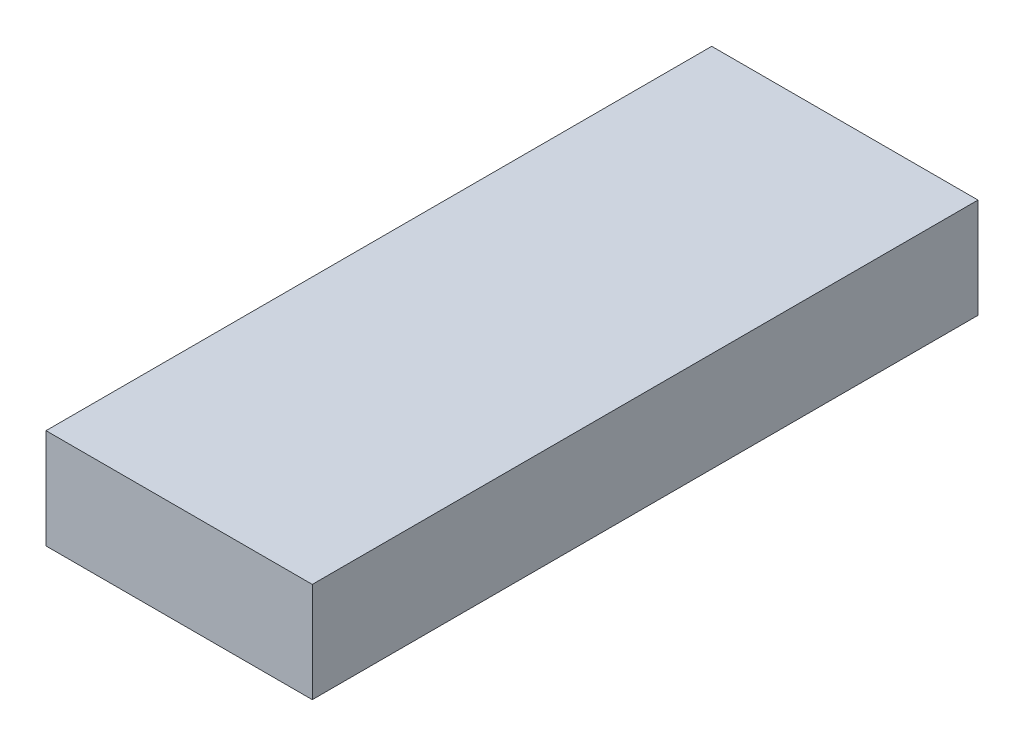
ISO-10303-21;
HEADER;
FILE_DESCRIPTION(('STEP AP214'),'2;1');
FILE_NAME('part.step','',(''),(''),'','','');
FILE_SCHEMA(('AUTOMOTIVE_DESIGN { 1 0 10303 214 1 1 1 1 }'));
ENDSEC;
DATA;
#1=APPLICATION_CONTEXT('core data for automotive mechanical design processes');
#2=APPLICATION_PROTOCOL_DEFINITION('international standard','automotive_design',2000,#1);
#3=PRODUCT_CONTEXT('',#1,'mechanical');
#4=PRODUCT('Part','Part','',(#3));
#5=PRODUCT_RELATED_PRODUCT_CATEGORY('part','',(#4));
#6=PRODUCT_DEFINITION_FORMATION('','',#4);
#7=PRODUCT_DEFINITION_CONTEXT('part definition',#1,'design');
#8=PRODUCT_DEFINITION('design','',#6,#7);
#9=PRODUCT_DEFINITION_SHAPE('','',#8);
#10=(LENGTH_UNIT() NAMED_UNIT(*) SI_UNIT(.MILLI.,.METRE.));
#11=(NAMED_UNIT(*) PLANE_ANGLE_UNIT() SI_UNIT($,.RADIAN.));
#12=(NAMED_UNIT(*) SI_UNIT($,.STERADIAN.) SOLID_ANGLE_UNIT());
#13=UNCERTAINTY_MEASURE_WITH_UNIT(LENGTH_MEASURE(1.E-05),#10,'distance_accuracy_value','');
#14=(GEOMETRIC_REPRESENTATION_CONTEXT(3) GLOBAL_UNCERTAINTY_ASSIGNED_CONTEXT((#13)) GLOBAL_UNIT_ASSIGNED_CONTEXT((#10,
#11,#12)) REPRESENTATION_CONTEXT('',''));
#15=CARTESIAN_POINT('',(0.,0.,0.));
#16=DIRECTION('',(0.,0.,1.));
#17=DIRECTION('',(1.,0.,0.));
#18=AXIS2_PLACEMENT_3D('',#15,#16,#17);
#19=CARTESIAN_POINT('',(0.,0.,50.8));
#20=DIRECTION('',(-1.,0.,0.));
#21=DIRECTION('',(0.,0.,1.));
#22=AXIS2_PLACEMENT_3D('',#19,#20,#21);
#23=PLANE('',#22);
#24=DIRECTION('',(0.,1.,0.));
#25=VECTOR('',#24,1.);
#26=CARTESIAN_POINT('',(0.,0.,0.));
#27=LINE('',#26,#25);
#28=CARTESIAN_POINT('',(0.,0.,0.));
#29=VERTEX_POINT('',#28);
#30=CARTESIAN_POINT('',(0.,7.62,0.));
#31=VERTEX_POINT('',#30);
#32=EDGE_CURVE('E96',#29,#31,#27,.T.);
#33=ORIENTED_EDGE('',*,*,#32,.T.);
#34=DIRECTION('',(0.,0.,-1.));
#35=VECTOR('',#34,1.);
#36=CARTESIAN_POINT('',(0.,7.62,50.8));
#37=LINE('',#36,#35);
#38=CARTESIAN_POINT('',(0.,7.62,50.8));
#39=VERTEX_POINT('',#38);
#40=EDGE_CURVE('E11',#39,#31,#37,.T.);
#41=ORIENTED_EDGE('',*,*,#40,.F.);
#42=DIRECTION('',(0.,1.,0.));
#43=VECTOR('',#42,1.);
#44=CARTESIAN_POINT('',(0.,0.,50.8));
#45=LINE('',#44,#43);
#46=CARTESIAN_POINT('',(0.,0.,50.8));
#47=VERTEX_POINT('',#46);
#48=EDGE_CURVE('E84',#47,#39,#45,.T.);
#49=ORIENTED_EDGE('',*,*,#48,.F.);
#50=DIRECTION('',(0.,0.,-1.));
#51=VECTOR('',#50,1.);
#52=CARTESIAN_POINT('',(0.,0.,50.8));
#53=LINE('',#52,#51);
#54=EDGE_CURVE('E92',#47,#29,#53,.T.);
#55=ORIENTED_EDGE('',*,*,#54,.T.);
#56=EDGE_LOOP('',(#33,#41,#49,#55));
#57=FACE_BOUND('',#56,.T.);
#58=ADVANCED_FACE('F33',(#57),#23,.F.);
#59=CARTESIAN_POINT('',(0.,7.62,50.8));
#60=DIRECTION('',(0.,-1.,0.));
#61=DIRECTION('',(1.,0.,0.));
#62=AXIS2_PLACEMENT_3D('',#59,#60,#61);
#63=PLANE('',#62);
#64=DIRECTION('',(-1.,0.,0.));
#65=VECTOR('',#64,1.);
#66=CARTESIAN_POINT('',(0.,7.62,0.));
#67=LINE('',#66,#65);
#68=CARTESIAN_POINT('',(-20.32,7.62,0.));
#69=VERTEX_POINT('',#68);
#70=EDGE_CURVE('E88',#31,#69,#67,.T.);
#71=ORIENTED_EDGE('',*,*,#70,.T.);
#72=DIRECTION('',(0.,0.,-1.));
#73=VECTOR('',#72,1.);
#74=CARTESIAN_POINT('',(-20.32,7.62,50.8));
#75=LINE('',#74,#73);
#76=CARTESIAN_POINT('',(-20.32,7.62,50.8));
#77=VERTEX_POINT('',#76);
#78=EDGE_CURVE('E41',#77,#69,#75,.T.);
#79=ORIENTED_EDGE('',*,*,#78,.F.);
#80=DIRECTION('',(-1.,0.,0.));
#81=VECTOR('',#80,1.);
#82=CARTESIAN_POINT('',(0.,7.62,50.8));
#83=LINE('',#82,#81);
#84=EDGE_CURVE('E79',#39,#77,#83,.T.);
#85=ORIENTED_EDGE('',*,*,#84,.F.);
#86=ORIENTED_EDGE('',*,*,#40,.T.);
#87=EDGE_LOOP('',(#71,#79,#85,#86));
#88=FACE_BOUND('',#87,.T.);
#89=ADVANCED_FACE('F87',(#88),#63,.F.);
#90=CARTESIAN_POINT('',(-20.32,0.,50.8));
#91=DIRECTION('',(1.,0.,0.));
#92=DIRECTION('',(0.,0.,-1.));
#93=AXIS2_PLACEMENT_3D('',#90,#91,#92);
#94=PLANE('',#93);
#95=DIRECTION('',(0.,-1.,0.));
#96=VECTOR('',#95,1.);
#97=CARTESIAN_POINT('',(-20.32,0.,0.));
#98=LINE('',#97,#96);
#99=CARTESIAN_POINT('',(-20.32,0.,0.));
#100=VERTEX_POINT('',#99);
#101=EDGE_CURVE('E66',#69,#100,#98,.T.);
#102=ORIENTED_EDGE('',*,*,#101,.T.);
#103=DIRECTION('',(0.,0.,-1.));
#104=VECTOR('',#103,1.);
#105=CARTESIAN_POINT('',(-20.32,0.,50.8));
#106=LINE('',#105,#104);
#107=CARTESIAN_POINT('',(-20.32,0.,50.8));
#108=VERTEX_POINT('',#107);
#109=EDGE_CURVE('E89',#108,#100,#106,.T.);
#110=ORIENTED_EDGE('',*,*,#109,.F.);
#111=DIRECTION('',(0.,-1.,0.));
#112=VECTOR('',#111,1.);
#113=CARTESIAN_POINT('',(-20.32,0.,50.8));
#114=LINE('',#113,#112);
#115=EDGE_CURVE('E82',#77,#108,#114,.T.);
#116=ORIENTED_EDGE('',*,*,#115,.F.);
#117=ORIENTED_EDGE('',*,*,#78,.T.);
#118=EDGE_LOOP('',(#102,#110,#116,#117));
#119=FACE_BOUND('',#118,.T.);
#120=ADVANCED_FACE('F90',(#119),#94,.F.);
#121=CARTESIAN_POINT('',(0.,0.,50.8));
#122=DIRECTION('',(0.,1.,0.));
#123=DIRECTION('',(-1.,0.,0.));
#124=AXIS2_PLACEMENT_3D('',#121,#122,#123);
#125=PLANE('',#124);
#126=DIRECTION('',(1.,0.,0.));
#127=VECTOR('',#126,1.);
#128=CARTESIAN_POINT('',(0.,0.,0.));
#129=LINE('',#128,#127);
#130=EDGE_CURVE('E72',#100,#29,#129,.T.);
#131=ORIENTED_EDGE('',*,*,#130,.T.);
#132=ORIENTED_EDGE('',*,*,#54,.F.);
#133=DIRECTION('',(1.,0.,0.));
#134=VECTOR('',#133,1.);
#135=CARTESIAN_POINT('',(0.,0.,50.8));
#136=LINE('',#135,#134);
#137=EDGE_CURVE('E49',#108,#47,#136,.T.);
#138=ORIENTED_EDGE('',*,*,#137,.F.);
#139=ORIENTED_EDGE('',*,*,#109,.T.);
#140=EDGE_LOOP('',(#131,#132,#138,#139));
#141=FACE_BOUND('',#140,.T.);
#142=ADVANCED_FACE('F103',(#141),#125,.F.);
#143=CARTESIAN_POINT('',(0.,0.,50.8));
#144=DIRECTION('',(0.,0.,1.));
#145=DIRECTION('',(1.,0.,0.));
#146=AXIS2_PLACEMENT_3D('',#143,#144,#145);
#147=PLANE('',#146);
#148=ORIENTED_EDGE('',*,*,#48,.T.);
#149=ORIENTED_EDGE('',*,*,#84,.T.);
#150=ORIENTED_EDGE('',*,*,#115,.T.);
#151=ORIENTED_EDGE('',*,*,#137,.T.);
#152=EDGE_LOOP('',(#148,#149,#150,#151));
#153=FACE_BOUND('',#152,.T.);
#154=ADVANCED_FACE('F80',(#153),#147,.T.);
#155=CARTESIAN_POINT('',(0.,0.,0.));
#156=DIRECTION('',(0.,0.,1.));
#157=DIRECTION('',(1.,0.,0.));
#158=AXIS2_PLACEMENT_3D('',#155,#156,#157);
#159=PLANE('',#158);
#160=ORIENTED_EDGE('',*,*,#32,.F.);
#161=ORIENTED_EDGE('',*,*,#130,.F.);
#162=ORIENTED_EDGE('',*,*,#101,.F.);
#163=ORIENTED_EDGE('',*,*,#70,.F.);
#164=EDGE_LOOP('',(#160,#161,#162,#163));
#165=FACE_BOUND('',#164,.T.);
#166=ADVANCED_FACE('F106',(#165),#159,.F.);
#167=CLOSED_SHELL('',(#58,#89,#120,#142,#154,#166));
#168=MANIFOLD_SOLID_BREP('B2',#167);
#169=ADVANCED_BREP_SHAPE_REPRESENTATION('',(#18,#168),#14);
#170=SHAPE_DEFINITION_REPRESENTATION(#9,#169);
ENDSEC;
END-ISO-10303-21;
